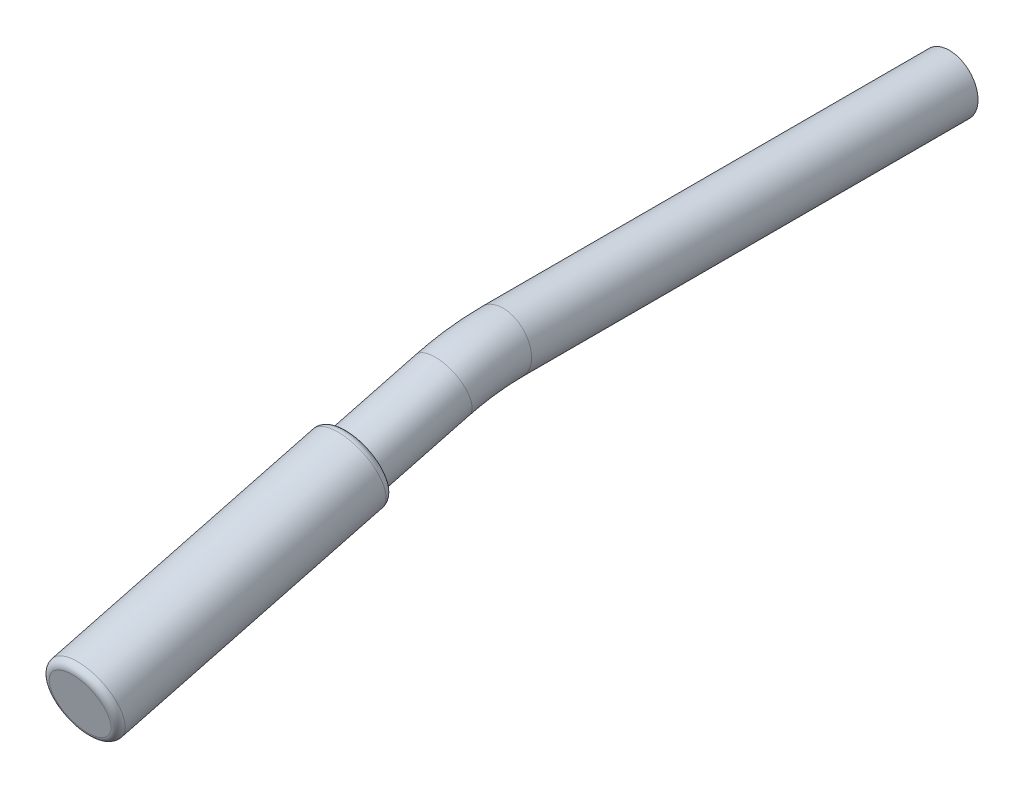
ISO-10303-21;
HEADER;
FILE_DESCRIPTION(('STEP AP214'),'2;1');
FILE_NAME('part.step','',(''),(''),'','','');
FILE_SCHEMA(('AUTOMOTIVE_DESIGN { 1 0 10303 214 1 1 1 1 }'));
ENDSEC;
DATA;
#1=APPLICATION_CONTEXT('core data for automotive mechanical design processes');
#2=APPLICATION_PROTOCOL_DEFINITION('international standard','automotive_design',2000,#1);
#3=PRODUCT_CONTEXT('',#1,'mechanical');
#4=PRODUCT('Part','Part','',(#3));
#5=PRODUCT_RELATED_PRODUCT_CATEGORY('part','',(#4));
#6=PRODUCT_DEFINITION_FORMATION('','',#4);
#7=PRODUCT_DEFINITION_CONTEXT('part definition',#1,'design');
#8=PRODUCT_DEFINITION('design','',#6,#7);
#9=PRODUCT_DEFINITION_SHAPE('','',#8);
#10=(LENGTH_UNIT() NAMED_UNIT(*) SI_UNIT(.MILLI.,.METRE.));
#11=(NAMED_UNIT(*) PLANE_ANGLE_UNIT() SI_UNIT($,.RADIAN.));
#12=(NAMED_UNIT(*) SI_UNIT($,.STERADIAN.) SOLID_ANGLE_UNIT());
#13=UNCERTAINTY_MEASURE_WITH_UNIT(LENGTH_MEASURE(1.E-05),#10,'distance_accuracy_value','');
#14=(GEOMETRIC_REPRESENTATION_CONTEXT(3) GLOBAL_UNCERTAINTY_ASSIGNED_CONTEXT((#13)) GLOBAL_UNIT_ASSIGNED_CONTEXT((#10,
#11,#12)) REPRESENTATION_CONTEXT('',''));
#15=CARTESIAN_POINT('',(0.,0.,0.));
#16=DIRECTION('',(0.,0.,1.));
#17=DIRECTION('',(1.,0.,0.));
#18=AXIS2_PLACEMENT_3D('',#15,#16,#17);
#19=CARTESIAN_POINT('',(0.,-43.0226625501465,364.383851684255));
#20=DIRECTION('',(0.,-0.253192785851585,0.967415842951062));
#21=DIRECTION('',(0.,-0.967415842951062,-0.253192785851585));
#22=AXIS2_PLACEMENT_3D('',#19,#20,#21);
#23=PLANE('',#22);
#24=CARTESIAN_POINT('',(0.,-43.0226625501475,364.383851684254));
#25=DIRECTION('',(0.,0.253192785851585,-0.967415842951062));
#26=DIRECTION('',(0.,0.967415842951062,0.253192785851585));
#27=AXIS2_PLACEMENT_3D('',#24,#25,#26);
#28=CIRCLE('',#27,12.5571583544125);
#29=CARTESIAN_POINT('',(0.,-30.8746686156436,367.563233590388));
#30=VERTEX_POINT('',#29);
#31=CARTESIAN_POINT('',(0.,-55.1706564846515,361.204469778121));
#32=VERTEX_POINT('',#31);
#33=EDGE_CURVE('E45',#30,#32,#28,.T.);
#34=ORIENTED_EDGE('',*,*,#33,.F.);
#35=CARTESIAN_POINT('',(0.,-43.0226625501475,364.383851684254));
#36=DIRECTION('',(0.,0.253192785851585,-0.967415842951062));
#37=DIRECTION('',(0.,-0.967415842951062,-0.253192785851585));
#38=AXIS2_PLACEMENT_3D('',#35,#36,#37);
#39=CIRCLE('',#38,12.5571583544125);
#40=EDGE_CURVE('E49',#32,#30,#39,.T.);
#41=ORIENTED_EDGE('',*,*,#40,.F.);
#42=EDGE_LOOP('',(#34,#41));
#43=FACE_BOUND('',#42,.T.);
#44=ADVANCED_FACE('F17',(#43),#23,.T.);
#45=CARTESIAN_POINT('',(0.,-42.2630841925928,361.481604155401));
#46=DIRECTION('',(0.,-0.253192785851585,0.967415842951062));
#47=DIRECTION('',(0.,-0.967415842951062,-0.253192785851585));
#48=AXIS2_PLACEMENT_3D('',#45,#46,#47);
#49=TOROIDAL_SURFACE('',#48,12.5571583544125,3.);
#50=CARTESIAN_POINT('',(0.,-42.2630841925928,361.481604155401));
#51=DIRECTION('',(0.,-0.253192785851585,0.967415842951062));
#52=DIRECTION('',(0.,-0.967415842951062,-0.253192785851585));
#53=AXIS2_PLACEMENT_3D('',#50,#51,#52);
#54=CIRCLE('',#53,15.5571583544125);
#55=CARTESIAN_POINT('',(0.,-57.3133256559499,357.542643891713));
#56=VERTEX_POINT('',#55);
#57=EDGE_CURVE('E55',#56,#56,#54,.F.);
#58=ORIENTED_EDGE('',*,*,#57,.F.);
#59=EDGE_LOOP('',(#58));
#60=FACE_BOUND('',#59,.T.);
#61=ORIENTED_EDGE('',*,*,#40,.T.);
#62=ORIENTED_EDGE('',*,*,#33,.T.);
#63=EDGE_LOOP('',(#61,#62));
#64=FACE_BOUND('',#63,.T.);
#65=ADVANCED_FACE('F54',(#60,#64),#49,.T.);
#66=CARTESIAN_POINT('',(0.,-12.892721033809,249.261366373078));
#67=DIRECTION('',(0.,-0.253192785851585,0.967415842951062));
#68=DIRECTION('',(0.,-0.967415842951062,-0.253192785851585));
#69=AXIS2_PLACEMENT_3D('',#66,#67,#68);
#70=CYLINDRICAL_SURFACE('',#69,15.5571583544125);
#71=CARTESIAN_POINT('',(0.,-13.6522993913637,252.163613901931));
#72=DIRECTION('',(0.,-0.253192785851585,0.967415842951062));
#73=DIRECTION('',(0.,-0.967415842951062,-0.253192785851585));
#74=AXIS2_PLACEMENT_3D('',#71,#72,#73);
#75=CIRCLE('',#74,15.5571583544125);
#76=CARTESIAN_POINT('',(0.,-28.7025408547208,248.224653638244));
#77=VERTEX_POINT('',#76);
#78=EDGE_CURVE('E78',#77,#77,#75,.F.);
#79=ORIENTED_EDGE('',*,*,#78,.F.);
#80=EDGE_LOOP('',(#79));
#81=FACE_BOUND('',#80,.T.);
#82=ORIENTED_EDGE('',*,*,#57,.T.);
#83=EDGE_LOOP('',(#82));
#84=FACE_BOUND('',#83,.T.);
#85=ADVANCED_FACE('F72',(#81,#84),#70,.T.);
#86=CARTESIAN_POINT('',(0.,-13.6522993913637,252.163613901931));
#87=DIRECTION('',(0.,-0.253192785851585,0.967415842951062));
#88=DIRECTION('',(0.,-0.967415842951062,-0.253192785851585));
#89=AXIS2_PLACEMENT_3D('',#86,#87,#88);
#90=TOROIDAL_SURFACE('',#89,12.5571583544125,3.);
#91=CARTESIAN_POINT('',(0.,-12.892721033809,249.261366373078));
#92=DIRECTION('',(0.,-0.253192785851585,0.967415842951062));
#93=DIRECTION('',(0.,-0.967415842951062,-0.253192785851585));
#94=AXIS2_PLACEMENT_3D('',#91,#92,#93);
#95=CIRCLE('',#94,12.5571583544125);
#96=CARTESIAN_POINT('',(0.,-25.0407149683129,246.081984466945));
#97=VERTEX_POINT('',#96);
#98=CARTESIAN_POINT('',(0.,-0.74472709930504,252.440748279211));
#99=VERTEX_POINT('',#98);
#100=EDGE_CURVE('E36',#97,#99,#95,.T.);
#101=ORIENTED_EDGE('',*,*,#100,.T.);
#102=CARTESIAN_POINT('',(0.,-12.892721033809,249.261366373078));
#103=DIRECTION('',(0.,-0.253192785851585,0.967415842951062));
#104=DIRECTION('',(0.,0.967415842951062,0.253192785851586));
#105=AXIS2_PLACEMENT_3D('',#102,#103,#104);
#106=CIRCLE('',#105,12.5571583544125);
#107=EDGE_CURVE('E86',#99,#97,#106,.T.);
#108=ORIENTED_EDGE('',*,*,#107,.T.);
#109=EDGE_LOOP('',(#101,#108));
#110=FACE_BOUND('',#109,.T.);
#111=ORIENTED_EDGE('',*,*,#78,.T.);
#112=EDGE_LOOP('',(#111));
#113=FACE_BOUND('',#112,.T.);
#114=ADVANCED_FACE('F98',(#110,#113),#90,.T.);
#115=CARTESIAN_POINT('',(0.,-12.892721033809,249.261366373078));
#116=DIRECTION('',(0.,-0.253192785851585,0.967415842951062));
#117=DIRECTION('',(0.,-0.967415842951062,-0.253192785851585));
#118=AXIS2_PLACEMENT_3D('',#115,#116,#117);
#119=PLANE('',#118);
#120=CARTESIAN_POINT('',(0.,-12.8927210338087,249.261366373078));
#121=DIRECTION('',(0.,-0.253192785851578,0.967415842951064));
#122=DIRECTION('',(0.,-0.967415842951064,-0.253192785851578));
#123=AXIS2_PLACEMENT_3D('',#120,#121,#122);
#124=CIRCLE('',#123,12.);
#125=CARTESIAN_POINT('',(0.,-24.5017111492215,246.22305294286));
#126=VERTEX_POINT('',#125);
#127=EDGE_CURVE('E87',#126,#126,#124,.F.);
#128=ORIENTED_EDGE('',*,*,#127,.F.);
#129=EDGE_LOOP('',(#128));
#130=FACE_BOUND('',#129,.T.);
#131=ORIENTED_EDGE('',*,*,#100,.F.);
#132=ORIENTED_EDGE('',*,*,#107,.F.);
#133=EDGE_LOOP('',(#131,#132));
#134=FACE_BOUND('',#133,.T.);
#135=ADVANCED_FACE('F108',(#130,#134),#119,.F.);
#136=CARTESIAN_POINT('',(0.,-3.25841570489375,212.449971531506));
#137=DIRECTION('',(0.,-0.253192785851578,0.967415842951064));
#138=DIRECTION('',(0.,-0.967415842951064,-0.253192785851578));
#139=AXIS2_PLACEMENT_3D('',#136,#137,#138);
#140=CYLINDRICAL_SURFACE('',#139,12.);
#141=ORIENTED_EDGE('',*,*,#127,.T.);
#142=EDGE_LOOP('',(#141));
#143=FACE_BOUND('',#142,.T.);
#144=CARTESIAN_POINT('',(0.,-3.2584157048938,212.449971531506));
#145=DIRECTION('',(0.,-0.253192785851582,0.967415842951063));
#146=DIRECTION('',(0.,0.967415842951063,0.253192785851582));
#147=AXIS2_PLACEMENT_3D('',#144,#145,#146);
#148=CIRCLE('',#147,12.);
#149=CARTESIAN_POINT('',(0.,8.35057441051896,215.488284961725));
#150=VERTEX_POINT('',#149);
#151=EDGE_CURVE('E90',#150,#150,#148,.F.);
#152=ORIENTED_EDGE('',*,*,#151,.F.);
#153=EDGE_LOOP('',(#152));
#154=FACE_BOUND('',#153,.T.);
#155=ADVANCED_FACE('F147',(#143,#154),#140,.T.);
#156=CARTESIAN_POINT('',(0.,-100.,187.130692946348));
#157=DIRECTION('',(1.,0.,0.));
#158=DIRECTION('',(0.,0.,-1.));
#159=AXIS2_PLACEMENT_3D('',#156,#157,#158);
#160=TOROIDAL_SURFACE('',#159,100.,12.);
#161=ORIENTED_EDGE('',*,*,#151,.T.);
#162=EDGE_LOOP('',(#161));
#163=FACE_BOUND('',#162,.T.);
#164=CARTESIAN_POINT('',(0.,0.,187.130692946347));
#165=DIRECTION('',(0.,0.,-1.));
#166=DIRECTION('',(0.,1.,0.));
#167=AXIS2_PLACEMENT_3D('',#164,#165,#166);
#168=CIRCLE('',#167,12.);
#169=CARTESIAN_POINT('',(0.,12.,187.130692946347));
#170=VERTEX_POINT('',#169);
#171=EDGE_CURVE('E28',#170,#170,#168,.T.);
#172=ORIENTED_EDGE('',*,*,#171,.F.);
#173=EDGE_LOOP('',(#172));
#174=FACE_BOUND('',#173,.T.);
#175=ADVANCED_FACE('F143',(#163,#174),#160,.T.);
#176=CARTESIAN_POINT('',(0.,0.,0.));
#177=DIRECTION('',(0.,0.,1.));
#178=DIRECTION('',(1.,0.,0.));
#179=AXIS2_PLACEMENT_3D('',#176,#177,#178);
#180=PLANE('',#179);
#181=CARTESIAN_POINT('',(0.,0.,0.));
#182=DIRECTION('',(0.,0.,-1.));
#183=DIRECTION('',(0.,1.,0.));
#184=AXIS2_PLACEMENT_3D('',#181,#182,#183);
#185=CIRCLE('',#184,12.);
#186=CARTESIAN_POINT('',(0.,12.,0.));
#187=VERTEX_POINT('',#186);
#188=EDGE_CURVE('E11',#187,#187,#185,.F.);
#189=ORIENTED_EDGE('',*,*,#188,.F.);
#190=EDGE_LOOP('',(#189));
#191=FACE_BOUND('',#190,.T.);
#192=ADVANCED_FACE('F146',(#191),#180,.F.);
#193=CARTESIAN_POINT('',(0.,0.,187.130692946347));
#194=DIRECTION('',(0.,0.,-1.));
#195=DIRECTION('',(0.,1.,0.));
#196=AXIS2_PLACEMENT_3D('',#193,#194,#195);
#197=CYLINDRICAL_SURFACE('',#196,12.);
#198=ORIENTED_EDGE('',*,*,#188,.T.);
#199=EDGE_LOOP('',(#198));
#200=FACE_BOUND('',#199,.T.);
#201=ORIENTED_EDGE('',*,*,#171,.T.);
#202=EDGE_LOOP('',(#201));
#203=FACE_BOUND('',#202,.T.);
#204=ADVANCED_FACE('F157',(#200,#203),#197,.T.);
#205=CLOSED_SHELL('',(#44,#65,#85,#114,#135,#155,#175,#192,#204));
#206=MANIFOLD_SOLID_BREP('B1',#205);
#207=ADVANCED_BREP_SHAPE_REPRESENTATION('',(#18,#206),#14);
#208=SHAPE_DEFINITION_REPRESENTATION(#9,#207);
ENDSEC;
END-ISO-10303-21;
